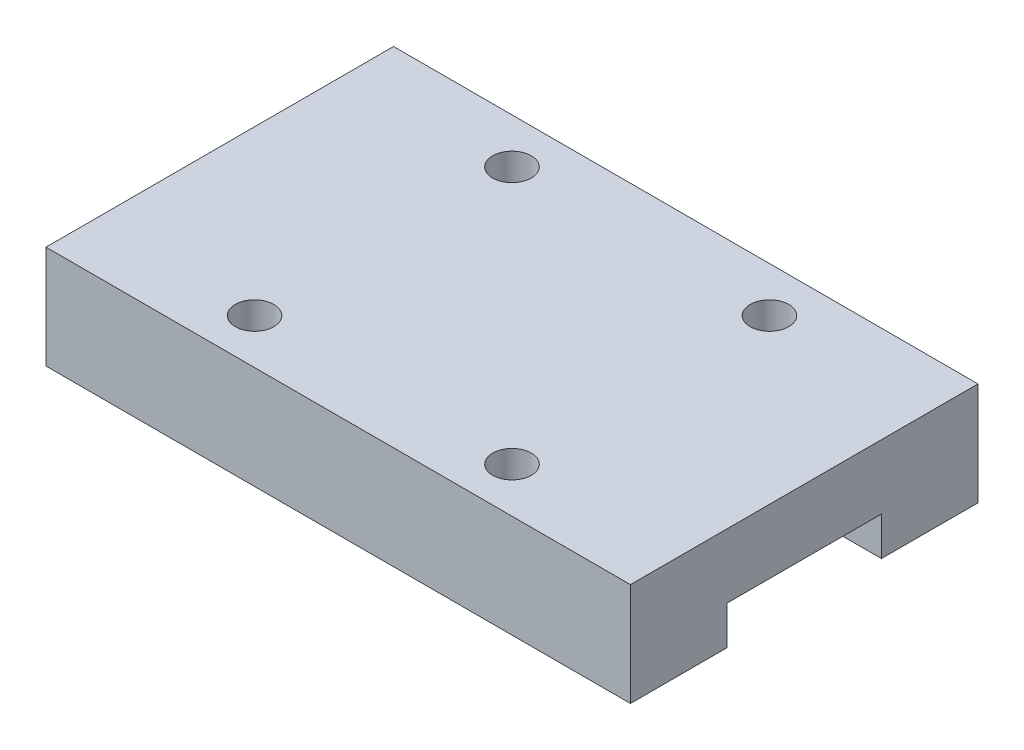
ISO-10303-21;
HEADER;
FILE_DESCRIPTION(('STEP AP214'),'2;1');
FILE_NAME('part.step','',(''),(''),'','','');
FILE_SCHEMA(('AUTOMOTIVE_DESIGN { 1 0 10303 214 1 1 1 1 }'));
ENDSEC;
DATA;
#1=APPLICATION_CONTEXT('core data for automotive mechanical design processes');
#2=APPLICATION_PROTOCOL_DEFINITION('international standard','automotive_design',2000,#1);
#3=PRODUCT_CONTEXT('',#1,'mechanical');
#4=PRODUCT('Part','Part','',(#3));
#5=PRODUCT_RELATED_PRODUCT_CATEGORY('part','',(#4));
#6=PRODUCT_DEFINITION_FORMATION('','',#4);
#7=PRODUCT_DEFINITION_CONTEXT('part definition',#1,'design');
#8=PRODUCT_DEFINITION('design','',#6,#7);
#9=PRODUCT_DEFINITION_SHAPE('','',#8);
#10=(LENGTH_UNIT() NAMED_UNIT(*) SI_UNIT(.MILLI.,.METRE.));
#11=(NAMED_UNIT(*) PLANE_ANGLE_UNIT() SI_UNIT($,.RADIAN.));
#12=(NAMED_UNIT(*) SI_UNIT($,.STERADIAN.) SOLID_ANGLE_UNIT());
#13=UNCERTAINTY_MEASURE_WITH_UNIT(LENGTH_MEASURE(1.E-05),#10,'distance_accuracy_value','');
#14=(GEOMETRIC_REPRESENTATION_CONTEXT(3) GLOBAL_UNCERTAINTY_ASSIGNED_CONTEXT((#13)) GLOBAL_UNIT_ASSIGNED_CONTEXT((#10,
#11,#12)) REPRESENTATION_CONTEXT('',''));
#15=CARTESIAN_POINT('',(0.,0.,0.));
#16=DIRECTION('',(0.,0.,1.));
#17=DIRECTION('',(1.,0.,0.));
#18=AXIS2_PLACEMENT_3D('',#15,#16,#17);
#19=CARTESIAN_POINT('',(0.,0.,0.));
#20=DIRECTION('',(0.,-1.,0.));
#21=DIRECTION('',(0.,0.,-1.));
#22=AXIS2_PLACEMENT_3D('',#19,#20,#21);
#23=PLANE('',#22);
#24=CARTESIAN_POINT('',(-10.,0.,10.));
#25=DIRECTION('',(0.,-1.,0.));
#26=DIRECTION('',(0.,0.,-1.));
#27=AXIS2_PLACEMENT_3D('',#24,#25,#26);
#28=CIRCLE('',#27,1.5);
#29=CARTESIAN_POINT('',(-10.,0.,8.5));
#30=VERTEX_POINT('',#29);
#31=EDGE_CURVE('E173',#30,#30,#28,.T.);
#32=ORIENTED_EDGE('',*,*,#31,.F.);
#33=EDGE_LOOP('',(#32));
#34=FACE_BOUND('',#33,.T.);
#35=CARTESIAN_POINT('',(9.99999999999999,0.,10.));
#36=DIRECTION('',(0.,-1.,0.));
#37=DIRECTION('',(0.,0.,-1.));
#38=AXIS2_PLACEMENT_3D('',#35,#36,#37);
#39=CIRCLE('',#38,1.5);
#40=CARTESIAN_POINT('',(9.99999999999999,0.,8.5));
#41=VERTEX_POINT('',#40);
#42=EDGE_CURVE('E158',#41,#41,#39,.T.);
#43=ORIENTED_EDGE('',*,*,#42,.F.);
#44=EDGE_LOOP('',(#43));
#45=FACE_BOUND('',#44,.T.);
#46=DIRECTION('',(1.,0.,0.));
#47=VECTOR('',#46,1.);
#48=CARTESIAN_POINT('',(-22.7,0.,5.99999999999999));
#49=LINE('',#48,#47);
#50=CARTESIAN_POINT('',(-22.7,0.,5.99999999999999));
#51=VERTEX_POINT('',#50);
#52=CARTESIAN_POINT('',(22.7,0.,5.99999999999999));
#53=VERTEX_POINT('',#52);
#54=EDGE_CURVE('E110',#51,#53,#49,.T.);
#55=ORIENTED_EDGE('',*,*,#54,.T.);
#56=DIRECTION('',(0.,0.,-1.));
#57=VECTOR('',#56,1.);
#58=CARTESIAN_POINT('',(22.7,0.,-13.5));
#59=LINE('',#58,#57);
#60=CARTESIAN_POINT('',(22.7,0.,13.5));
#61=VERTEX_POINT('',#60);
#62=EDGE_CURVE('E143',#61,#53,#59,.T.);
#63=ORIENTED_EDGE('',*,*,#62,.F.);
#64=DIRECTION('',(1.,0.,0.));
#65=VECTOR('',#64,1.);
#66=CARTESIAN_POINT('',(22.7,0.,13.5));
#67=LINE('',#66,#65);
#68=CARTESIAN_POINT('',(-22.7,0.,13.5));
#69=VERTEX_POINT('',#68);
#70=EDGE_CURVE('E131',#69,#61,#67,.T.);
#71=ORIENTED_EDGE('',*,*,#70,.F.);
#72=DIRECTION('',(0.,0.,1.));
#73=VECTOR('',#72,1.);
#74=CARTESIAN_POINT('',(-22.7,0.,-13.5));
#75=LINE('',#74,#73);
#76=EDGE_CURVE('E126',#51,#69,#75,.T.);
#77=ORIENTED_EDGE('',*,*,#76,.F.);
#78=EDGE_LOOP('',(#55,#63,#71,#77));
#79=FACE_BOUND('',#78,.T.);
#80=ADVANCED_FACE('F34',(#34,#45,#79),#23,.T.);
#81=CARTESIAN_POINT('',(-22.7,8.,-13.5));
#82=DIRECTION('',(1.,0.,0.));
#83=DIRECTION('',(0.,0.,-1.));
#84=AXIS2_PLACEMENT_3D('',#81,#82,#83);
#85=PLANE('',#84);
#86=DIRECTION('',(0.,0.,1.));
#87=VECTOR('',#86,1.);
#88=CARTESIAN_POINT('',(-22.7,3.,5.99999999999999));
#89=LINE('',#88,#87);
#90=CARTESIAN_POINT('',(-22.7,3.,-6.00000000000001));
#91=VERTEX_POINT('',#90);
#92=CARTESIAN_POINT('',(-22.7,3.,5.99999999999999));
#93=VERTEX_POINT('',#92);
#94=EDGE_CURVE('E122',#91,#93,#89,.T.);
#95=ORIENTED_EDGE('',*,*,#94,.T.);
#96=DIRECTION('',(0.,-1.,0.));
#97=VECTOR('',#96,1.);
#98=CARTESIAN_POINT('',(-22.7,0.,5.99999999999999));
#99=LINE('',#98,#97);
#100=EDGE_CURVE('E113',#93,#51,#99,.T.);
#101=ORIENTED_EDGE('',*,*,#100,.T.);
#102=ORIENTED_EDGE('',*,*,#76,.T.);
#103=DIRECTION('',(0.,-1.,0.));
#104=VECTOR('',#103,1.);
#105=CARTESIAN_POINT('',(-22.7,8.,13.5));
#106=LINE('',#105,#104);
#107=CARTESIAN_POINT('',(-22.7,8.,13.5));
#108=VERTEX_POINT('',#107);
#109=EDGE_CURVE('E11',#108,#69,#106,.T.);
#110=ORIENTED_EDGE('',*,*,#109,.F.);
#111=DIRECTION('',(0.,0.,1.));
#112=VECTOR('',#111,1.);
#113=CARTESIAN_POINT('',(-22.7,8.,-13.5));
#114=LINE('',#113,#112);
#115=CARTESIAN_POINT('',(-22.7,8.,-13.5));
#116=VERTEX_POINT('',#115);
#117=EDGE_CURVE('E146',#116,#108,#114,.T.);
#118=ORIENTED_EDGE('',*,*,#117,.F.);
#119=DIRECTION('',(0.,-1.,0.));
#120=VECTOR('',#119,1.);
#121=CARTESIAN_POINT('',(-22.7,8.,-13.5));
#122=LINE('',#121,#120);
#123=CARTESIAN_POINT('',(-22.7,0.,-13.5));
#124=VERTEX_POINT('',#123);
#125=EDGE_CURVE('E147',#116,#124,#122,.T.);
#126=ORIENTED_EDGE('',*,*,#125,.T.);
#127=CARTESIAN_POINT('',(-22.7,0.,-6.00000000000001));
#128=VERTEX_POINT('',#127);
#129=EDGE_CURVE('E132',#124,#128,#75,.T.);
#130=ORIENTED_EDGE('',*,*,#129,.T.);
#131=DIRECTION('',(0.,1.,0.));
#132=VECTOR('',#131,1.);
#133=CARTESIAN_POINT('',(-22.7,0.,-6.00000000000001));
#134=LINE('',#133,#132);
#135=EDGE_CURVE('E51',#128,#91,#134,.T.);
#136=ORIENTED_EDGE('',*,*,#135,.T.);
#137=EDGE_LOOP('',(#95,#101,#102,#110,#118,#126,#130,#136));
#138=FACE_BOUND('',#137,.T.);
#139=ADVANCED_FACE('F36',(#138),#85,.F.);
#140=CARTESIAN_POINT('',(22.7,8.,13.5));
#141=DIRECTION('',(0.,0.,-1.));
#142=DIRECTION('',(-1.,0.,0.));
#143=AXIS2_PLACEMENT_3D('',#140,#141,#142);
#144=PLANE('',#143);
#145=ORIENTED_EDGE('',*,*,#70,.T.);
#146=DIRECTION('',(0.,-1.,0.));
#147=VECTOR('',#146,1.);
#148=CARTESIAN_POINT('',(22.7,8.,13.5));
#149=LINE('',#148,#147);
#150=CARTESIAN_POINT('',(22.7,8.,13.5));
#151=VERTEX_POINT('',#150);
#152=EDGE_CURVE('E43',#151,#61,#149,.T.);
#153=ORIENTED_EDGE('',*,*,#152,.F.);
#154=DIRECTION('',(1.,0.,0.));
#155=VECTOR('',#154,1.);
#156=CARTESIAN_POINT('',(22.7,8.,13.5));
#157=LINE('',#156,#155);
#158=EDGE_CURVE('E88',#108,#151,#157,.T.);
#159=ORIENTED_EDGE('',*,*,#158,.F.);
#160=ORIENTED_EDGE('',*,*,#109,.T.);
#161=EDGE_LOOP('',(#145,#153,#159,#160));
#162=FACE_BOUND('',#161,.T.);
#163=ADVANCED_FACE('F198',(#162),#144,.F.);
#164=CARTESIAN_POINT('',(22.7,8.,-13.5));
#165=DIRECTION('',(-1.,0.,0.));
#166=DIRECTION('',(0.,0.,1.));
#167=AXIS2_PLACEMENT_3D('',#164,#165,#166);
#168=PLANE('',#167);
#169=ORIENTED_EDGE('',*,*,#62,.T.);
#170=DIRECTION('',(0.,-1.,0.));
#171=VECTOR('',#170,1.);
#172=CARTESIAN_POINT('',(22.7,0.,5.99999999999999));
#173=LINE('',#172,#171);
#174=CARTESIAN_POINT('',(22.7,3.,5.99999999999999));
#175=VERTEX_POINT('',#174);
#176=EDGE_CURVE('E116',#175,#53,#173,.T.);
#177=ORIENTED_EDGE('',*,*,#176,.F.);
#178=DIRECTION('',(0.,0.,1.));
#179=VECTOR('',#178,1.);
#180=CARTESIAN_POINT('',(22.7,3.,5.99999999999999));
#181=LINE('',#180,#179);
#182=CARTESIAN_POINT('',(22.7,3.,-6.00000000000001));
#183=VERTEX_POINT('',#182);
#184=EDGE_CURVE('E129',#183,#175,#181,.T.);
#185=ORIENTED_EDGE('',*,*,#184,.F.);
#186=DIRECTION('',(0.,1.,0.));
#187=VECTOR('',#186,1.);
#188=CARTESIAN_POINT('',(22.7,0.,-6.00000000000001));
#189=LINE('',#188,#187);
#190=CARTESIAN_POINT('',(22.7,0.,-6.00000000000001));
#191=VERTEX_POINT('',#190);
#192=EDGE_CURVE('E179',#191,#183,#189,.T.);
#193=ORIENTED_EDGE('',*,*,#192,.F.);
#194=CARTESIAN_POINT('',(22.7,0.,-13.5));
#195=VERTEX_POINT('',#194);
#196=EDGE_CURVE('E142',#191,#195,#59,.T.);
#197=ORIENTED_EDGE('',*,*,#196,.T.);
#198=DIRECTION('',(0.,-1.,0.));
#199=VECTOR('',#198,1.);
#200=CARTESIAN_POINT('',(22.7,8.,-13.5));
#201=LINE('',#200,#199);
#202=CARTESIAN_POINT('',(22.7,8.,-13.5));
#203=VERTEX_POINT('',#202);
#204=EDGE_CURVE('E149',#203,#195,#201,.T.);
#205=ORIENTED_EDGE('',*,*,#204,.F.);
#206=DIRECTION('',(0.,0.,-1.));
#207=VECTOR('',#206,1.);
#208=CARTESIAN_POINT('',(22.7,8.,-13.5));
#209=LINE('',#208,#207);
#210=EDGE_CURVE('E187',#151,#203,#209,.T.);
#211=ORIENTED_EDGE('',*,*,#210,.F.);
#212=ORIENTED_EDGE('',*,*,#152,.T.);
#213=EDGE_LOOP('',(#169,#177,#185,#193,#197,#205,#211,#212));
#214=FACE_BOUND('',#213,.T.);
#215=ADVANCED_FACE('F192',(#214),#168,.F.);
#216=CARTESIAN_POINT('',(22.7,8.,-13.5));
#217=DIRECTION('',(0.,0.,1.));
#218=DIRECTION('',(1.,0.,0.));
#219=AXIS2_PLACEMENT_3D('',#216,#217,#218);
#220=PLANE('',#219);
#221=DIRECTION('',(-1.,0.,0.));
#222=VECTOR('',#221,1.);
#223=CARTESIAN_POINT('',(22.7,0.,-13.5));
#224=LINE('',#223,#222);
#225=EDGE_CURVE('E81',#195,#124,#224,.T.);
#226=ORIENTED_EDGE('',*,*,#225,.T.);
#227=ORIENTED_EDGE('',*,*,#125,.F.);
#228=DIRECTION('',(-1.,0.,0.));
#229=VECTOR('',#228,1.);
#230=CARTESIAN_POINT('',(22.7,8.,-13.5));
#231=LINE('',#230,#229);
#232=EDGE_CURVE('E60',#203,#116,#231,.T.);
#233=ORIENTED_EDGE('',*,*,#232,.F.);
#234=ORIENTED_EDGE('',*,*,#204,.T.);
#235=EDGE_LOOP('',(#226,#227,#233,#234));
#236=FACE_BOUND('',#235,.T.);
#237=ADVANCED_FACE('F195',(#236),#220,.F.);
#238=CARTESIAN_POINT('',(0.,8.,0.));
#239=DIRECTION('',(0.,-1.,0.));
#240=DIRECTION('',(0.,0.,-1.));
#241=AXIS2_PLACEMENT_3D('',#238,#239,#240);
#242=PLANE('',#241);
#243=CARTESIAN_POINT('',(9.99999999999999,8.,-10.));
#244=DIRECTION('',(0.,1.,0.));
#245=DIRECTION('',(0.,0.,1.));
#246=AXIS2_PLACEMENT_3D('',#243,#244,#245);
#247=CIRCLE('',#246,1.5);
#248=CARTESIAN_POINT('',(9.99999999999999,8.,-8.5));
#249=VERTEX_POINT('',#248);
#250=EDGE_CURVE('E169',#249,#249,#247,.T.);
#251=ORIENTED_EDGE('',*,*,#250,.F.);
#252=EDGE_LOOP('',(#251));
#253=FACE_BOUND('',#252,.T.);
#254=CARTESIAN_POINT('',(-10.,8.,-10.));
#255=DIRECTION('',(0.,1.,0.));
#256=DIRECTION('',(0.,0.,1.));
#257=AXIS2_PLACEMENT_3D('',#254,#255,#256);
#258=CIRCLE('',#257,1.5);
#259=CARTESIAN_POINT('',(-10.,8.,-8.5));
#260=VERTEX_POINT('',#259);
#261=EDGE_CURVE('E165',#260,#260,#258,.T.);
#262=ORIENTED_EDGE('',*,*,#261,.F.);
#263=EDGE_LOOP('',(#262));
#264=FACE_BOUND('',#263,.T.);
#265=CARTESIAN_POINT('',(-10.,8.,10.));
#266=DIRECTION('',(0.,1.,0.));
#267=DIRECTION('',(0.,0.,1.));
#268=AXIS2_PLACEMENT_3D('',#265,#266,#267);
#269=CIRCLE('',#268,1.5);
#270=CARTESIAN_POINT('',(-10.,8.,11.5));
#271=VERTEX_POINT('',#270);
#272=EDGE_CURVE('E160',#271,#271,#269,.T.);
#273=ORIENTED_EDGE('',*,*,#272,.F.);
#274=EDGE_LOOP('',(#273));
#275=FACE_BOUND('',#274,.T.);
#276=CARTESIAN_POINT('',(9.99999999999999,8.,10.));
#277=DIRECTION('',(0.,1.,0.));
#278=DIRECTION('',(0.,0.,1.));
#279=AXIS2_PLACEMENT_3D('',#276,#277,#278);
#280=CIRCLE('',#279,1.5);
#281=CARTESIAN_POINT('',(9.99999999999999,8.,11.5));
#282=VERTEX_POINT('',#281);
#283=EDGE_CURVE('E154',#282,#282,#280,.T.);
#284=ORIENTED_EDGE('',*,*,#283,.F.);
#285=EDGE_LOOP('',(#284));
#286=FACE_BOUND('',#285,.T.);
#287=ORIENTED_EDGE('',*,*,#117,.T.);
#288=ORIENTED_EDGE('',*,*,#158,.T.);
#289=ORIENTED_EDGE('',*,*,#210,.T.);
#290=ORIENTED_EDGE('',*,*,#232,.T.);
#291=EDGE_LOOP('',(#287,#288,#289,#290));
#292=FACE_BOUND('',#291,.T.);
#293=ADVANCED_FACE('F190',(#253,#264,#275,#286,#292),#242,.F.);
#294=CARTESIAN_POINT('',(9.99999999999999,0.,-10.));
#295=DIRECTION('',(0.,-1.,0.));
#296=DIRECTION('',(0.,0.,-1.));
#297=AXIS2_PLACEMENT_3D('',#294,#295,#296);
#298=CIRCLE('',#297,1.5);
#299=CARTESIAN_POINT('',(9.99999999999999,0.,-11.5));
#300=VERTEX_POINT('',#299);
#301=EDGE_CURVE('E38',#300,#300,#298,.T.);
#302=ORIENTED_EDGE('',*,*,#301,.F.);
#303=EDGE_LOOP('',(#302));
#304=FACE_BOUND('',#303,.T.);
#305=CARTESIAN_POINT('',(-10.,0.,-10.));
#306=DIRECTION('',(0.,-1.,0.));
#307=DIRECTION('',(0.,0.,-1.));
#308=AXIS2_PLACEMENT_3D('',#305,#306,#307);
#309=CIRCLE('',#308,1.5);
#310=CARTESIAN_POINT('',(-10.,0.,-11.5));
#311=VERTEX_POINT('',#310);
#312=EDGE_CURVE('E152',#311,#311,#309,.T.);
#313=ORIENTED_EDGE('',*,*,#312,.F.);
#314=EDGE_LOOP('',(#313));
#315=FACE_BOUND('',#314,.T.);
#316=DIRECTION('',(1.,0.,0.));
#317=VECTOR('',#316,1.);
#318=CARTESIAN_POINT('',(-22.7,0.,-6.00000000000001));
#319=LINE('',#318,#317);
#320=EDGE_CURVE('E121',#128,#191,#319,.T.);
#321=ORIENTED_EDGE('',*,*,#320,.F.);
#322=ORIENTED_EDGE('',*,*,#129,.F.);
#323=ORIENTED_EDGE('',*,*,#225,.F.);
#324=ORIENTED_EDGE('',*,*,#196,.F.);
#325=EDGE_LOOP('',(#321,#322,#323,#324));
#326=FACE_BOUND('',#325,.T.);
#327=ADVANCED_FACE('F204',(#304,#315,#326),#23,.T.);
#328=CARTESIAN_POINT('',(-22.7,0.,5.99999999999999));
#329=DIRECTION('',(0.,0.,1.));
#330=DIRECTION('',(1.,0.,0.));
#331=AXIS2_PLACEMENT_3D('',#328,#329,#330);
#332=PLANE('',#331);
#333=ORIENTED_EDGE('',*,*,#176,.T.);
#334=ORIENTED_EDGE('',*,*,#54,.F.);
#335=ORIENTED_EDGE('',*,*,#100,.F.);
#336=DIRECTION('',(1.,0.,0.));
#337=VECTOR('',#336,1.);
#338=CARTESIAN_POINT('',(-22.7,3.,5.99999999999999));
#339=LINE('',#338,#337);
#340=EDGE_CURVE('E133',#93,#175,#339,.T.);
#341=ORIENTED_EDGE('',*,*,#340,.T.);
#342=EDGE_LOOP('',(#333,#334,#335,#341));
#343=FACE_BOUND('',#342,.T.);
#344=ADVANCED_FACE('F112',(#343),#332,.F.);
#345=CARTESIAN_POINT('',(-22.7,3.,5.99999999999999));
#346=DIRECTION('',(0.,1.,0.));
#347=DIRECTION('',(0.,0.,1.));
#348=AXIS2_PLACEMENT_3D('',#345,#346,#347);
#349=PLANE('',#348);
#350=ORIENTED_EDGE('',*,*,#184,.T.);
#351=ORIENTED_EDGE('',*,*,#340,.F.);
#352=ORIENTED_EDGE('',*,*,#94,.F.);
#353=DIRECTION('',(1.,0.,0.));
#354=VECTOR('',#353,1.);
#355=CARTESIAN_POINT('',(-22.7,3.,-6.00000000000001));
#356=LINE('',#355,#354);
#357=EDGE_CURVE('E136',#91,#183,#356,.T.);
#358=ORIENTED_EDGE('',*,*,#357,.T.);
#359=EDGE_LOOP('',(#350,#351,#352,#358));
#360=FACE_BOUND('',#359,.T.);
#361=ADVANCED_FACE('F201',(#360),#349,.F.);
#362=CARTESIAN_POINT('',(-22.7,0.,-6.00000000000001));
#363=DIRECTION('',(0.,0.,-1.));
#364=DIRECTION('',(-1.,0.,0.));
#365=AXIS2_PLACEMENT_3D('',#362,#363,#364);
#366=PLANE('',#365);
#367=ORIENTED_EDGE('',*,*,#192,.T.);
#368=ORIENTED_EDGE('',*,*,#357,.F.);
#369=ORIENTED_EDGE('',*,*,#135,.F.);
#370=ORIENTED_EDGE('',*,*,#320,.T.);
#371=EDGE_LOOP('',(#367,#368,#369,#370));
#372=FACE_BOUND('',#371,.T.);
#373=ADVANCED_FACE('F202',(#372),#366,.F.);
#374=CARTESIAN_POINT('',(-10.,-2.,-10.));
#375=DIRECTION('',(0.,1.,0.));
#376=DIRECTION('',(0.,0.,1.));
#377=AXIS2_PLACEMENT_3D('',#374,#375,#376);
#378=CYLINDRICAL_SURFACE('',#377,1.5);
#379=ORIENTED_EDGE('',*,*,#312,.T.);
#380=EDGE_LOOP('',(#379));
#381=FACE_BOUND('',#380,.T.);
#382=ORIENTED_EDGE('',*,*,#261,.T.);
#383=EDGE_LOOP('',(#382));
#384=FACE_BOUND('',#383,.T.);
#385=ADVANCED_FACE('F238',(#381,#384),#378,.F.);
#386=CARTESIAN_POINT('',(9.99999999999999,-2.,-10.));
#387=DIRECTION('',(0.,1.,0.));
#388=DIRECTION('',(0.,0.,1.));
#389=AXIS2_PLACEMENT_3D('',#386,#387,#388);
#390=CYLINDRICAL_SURFACE('',#389,1.5);
#391=ORIENTED_EDGE('',*,*,#301,.T.);
#392=EDGE_LOOP('',(#391));
#393=FACE_BOUND('',#392,.T.);
#394=ORIENTED_EDGE('',*,*,#250,.T.);
#395=EDGE_LOOP('',(#394));
#396=FACE_BOUND('',#395,.T.);
#397=ADVANCED_FACE('F230',(#393,#396),#390,.F.);
#398=CARTESIAN_POINT('',(9.99999999999999,-2.,10.));
#399=DIRECTION('',(0.,1.,0.));
#400=DIRECTION('',(0.,0.,1.));
#401=AXIS2_PLACEMENT_3D('',#398,#399,#400);
#402=CYLINDRICAL_SURFACE('',#401,1.5);
#403=ORIENTED_EDGE('',*,*,#42,.T.);
#404=EDGE_LOOP('',(#403));
#405=FACE_BOUND('',#404,.T.);
#406=ORIENTED_EDGE('',*,*,#283,.T.);
#407=EDGE_LOOP('',(#406));
#408=FACE_BOUND('',#407,.T.);
#409=ADVANCED_FACE('F227',(#405,#408),#402,.F.);
#410=CARTESIAN_POINT('',(-10.,-2.,10.));
#411=DIRECTION('',(0.,1.,0.));
#412=DIRECTION('',(0.,0.,1.));
#413=AXIS2_PLACEMENT_3D('',#410,#411,#412);
#414=CYLINDRICAL_SURFACE('',#413,1.5);
#415=ORIENTED_EDGE('',*,*,#31,.T.);
#416=EDGE_LOOP('',(#415));
#417=FACE_BOUND('',#416,.T.);
#418=ORIENTED_EDGE('',*,*,#272,.T.);
#419=EDGE_LOOP('',(#418));
#420=FACE_BOUND('',#419,.T.);
#421=ADVANCED_FACE('F229',(#417,#420),#414,.F.);
#422=CLOSED_SHELL('',(#80,#139,#163,#215,#237,#293,#327,#344,#361,#373,#385,#397,#409,#421));
#423=MANIFOLD_SOLID_BREP('B2',#422);
#424=ADVANCED_BREP_SHAPE_REPRESENTATION('',(#18,#423),#14);
#425=SHAPE_DEFINITION_REPRESENTATION(#9,#424);
ENDSEC;
END-ISO-10303-21;
